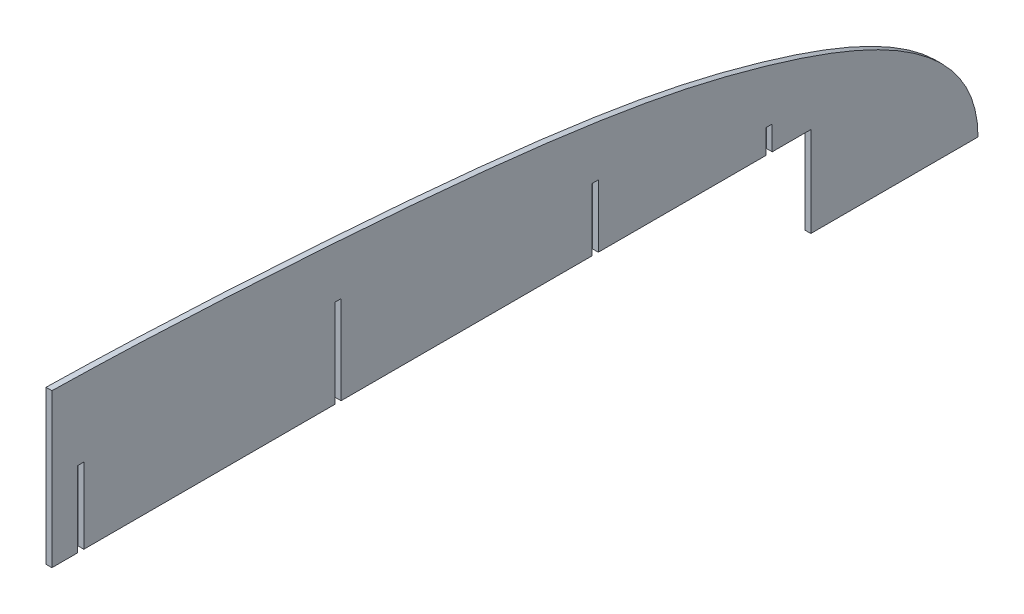
ISO-10303-21;
HEADER;
FILE_DESCRIPTION(('STEP AP214'),'2;1');
FILE_NAME('part.step','',(''),(''),'','','');
FILE_SCHEMA(('AUTOMOTIVE_DESIGN { 1 0 10303 214 1 1 1 1 }'));
ENDSEC;
DATA;
#1=APPLICATION_CONTEXT('core data for automotive mechanical design processes');
#2=APPLICATION_PROTOCOL_DEFINITION('international standard','automotive_design',2000,#1);
#3=PRODUCT_CONTEXT('',#1,'mechanical');
#4=PRODUCT('Part','Part','',(#3));
#5=PRODUCT_RELATED_PRODUCT_CATEGORY('part','',(#4));
#6=PRODUCT_DEFINITION_FORMATION('','',#4);
#7=PRODUCT_DEFINITION_CONTEXT('part definition',#1,'design');
#8=PRODUCT_DEFINITION('design','',#6,#7);
#9=PRODUCT_DEFINITION_SHAPE('','',#8);
#10=(LENGTH_UNIT() NAMED_UNIT(*) SI_UNIT(.MILLI.,.METRE.));
#11=(NAMED_UNIT(*) PLANE_ANGLE_UNIT() SI_UNIT($,.RADIAN.));
#12=(NAMED_UNIT(*) SI_UNIT($,.STERADIAN.) SOLID_ANGLE_UNIT());
#13=UNCERTAINTY_MEASURE_WITH_UNIT(LENGTH_MEASURE(1.E-05),#10,'distance_accuracy_value','');
#14=(GEOMETRIC_REPRESENTATION_CONTEXT(3) GLOBAL_UNCERTAINTY_ASSIGNED_CONTEXT((#13)) GLOBAL_UNIT_ASSIGNED_CONTEXT((#10,
#11,#12)) REPRESENTATION_CONTEXT('',''));
#15=CARTESIAN_POINT('',(0.,0.,0.));
#16=DIRECTION('',(0.,0.,1.));
#17=DIRECTION('',(1.,0.,0.));
#18=AXIS2_PLACEMENT_3D('',#15,#16,#17);
#19=CARTESIAN_POINT('',(2.921,39.6875,-381.));
#20=CARTESIAN_POINT('',(2.921,130.986638489082,-381.));
#21=CARTESIAN_POINT('',(2.921,207.087014824068,-192.838300002168));
#22=CARTESIAN_POINT('',(2.921,247.75344053516,19.653982034319));
#23=CARTESIAN_POINT('',(2.921,268.162472470018,254.872972462984));
#24=CARTESIAN_POINT('',(2.921,284.069445788471,549.517003243596));
#25=CARTESIAN_POINT('',(2.921,278.192638574035,889.863220578499));
#26=CARTESIAN_POINT('',(2.921,278.653196970913,1168.26453485061));
#27=CARTESIAN_POINT('',(2.921,238.643618873348,1400.44895878215));
#28=CARTESIAN_POINT('',(2.921,123.854582151285,1460.5));
#29=CARTESIAN_POINT('',(2.921,39.6875,1460.5));
#30=B_SPLINE_CURVE_WITH_KNOTS('',3,(#19,#20,#21,#22,#23,#24,#25,#26,#27,#28,#29),.UNSPECIFIED.,
.F.,.F.,(4,1,1,1,1,1,1,1,4),(0.,0.128798302419609,0.218593162728591,0.344649658829917,
0.470237251274815,0.658383603807385,0.846764992474732,0.885552356703056,1.),.UNSPECIFIED.);
#31=DIRECTION('',(-1.,0.,0.));
#32=VECTOR('',#31,1.);
#33=SURFACE_OF_LINEAR_EXTRUSION('',#30,#32);
#34=CARTESIAN_POINT('',(-2.921,39.6875,-381.));
#35=CARTESIAN_POINT('',(-2.921,130.986638489082,-381.));
#36=CARTESIAN_POINT('',(-2.921,207.087014824068,-192.838300002168));
#37=CARTESIAN_POINT('',(-2.921,247.75344053516,19.653982034319));
#38=CARTESIAN_POINT('',(-2.921,268.162472470018,254.872972462984));
#39=CARTESIAN_POINT('',(-2.921,284.069445788471,549.517003243596));
#40=CARTESIAN_POINT('',(-2.921,278.192638574035,889.863220578499));
#41=CARTESIAN_POINT('',(-2.921,278.653196970913,1168.26453485061));
#42=CARTESIAN_POINT('',(-2.921,238.643618873348,1400.44895878215));
#43=CARTESIAN_POINT('',(-2.921,123.854582151285,1460.5));
#44=CARTESIAN_POINT('',(-2.921,39.6875,1460.5));
#45=B_SPLINE_CURVE_WITH_KNOTS('',3,(#34,#35,#36,#37,#38,#39,#40,#41,#42,#43,#44),.UNSPECIFIED.,
.F.,.F.,(4,1,1,1,1,1,1,1,4),(0.,0.128798302419609,0.218593162728591,0.344649658829917,
0.470237251274815,0.658383603807385,0.846764992474732,0.885552356703056,1.),.UNSPECIFIED.);
#46=CARTESIAN_POINT('',(-2.921,39.6875,-381.));
#47=VERTEX_POINT('',#46);
#48=CARTESIAN_POINT('',(-2.921,279.971033323289,533.4));
#49=VERTEX_POINT('',#48);
#50=EDGE_CURVE('E196',#47,#49,#45,.T.);
#51=ORIENTED_EDGE('',*,*,#50,.T.);
#52=DIRECTION('',(-1.,0.,0.));
#53=VECTOR('',#52,1.);
#54=CARTESIAN_POINT('',(2.921,279.971033323289,533.4));
#55=LINE('',#54,#53);
#56=CARTESIAN_POINT('',(2.921,279.971033323289,533.4));
#57=VERTEX_POINT('',#56);
#58=EDGE_CURVE('E198',#49,#57,#55,.F.);
#59=ORIENTED_EDGE('',*,*,#58,.T.);
#60=CARTESIAN_POINT('',(2.921,39.6875,-381.));
#61=VERTEX_POINT('',#60);
#62=EDGE_CURVE('E197',#61,#57,#30,.T.);
#63=ORIENTED_EDGE('',*,*,#62,.F.);
#64=DIRECTION('',(-1.,0.,0.));
#65=VECTOR('',#64,1.);
#66=CARTESIAN_POINT('',(2.921,39.6875,-381.));
#67=LINE('',#66,#65);
#68=EDGE_CURVE('E11',#61,#47,#67,.T.);
#69=ORIENTED_EDGE('',*,*,#68,.T.);
#70=EDGE_LOOP('',(#51,#59,#63,#69));
#71=FACE_BOUND('',#70,.T.);
#72=ADVANCED_FACE('F33',(#71),#33,.F.);
#73=CARTESIAN_POINT('',(2.921,39.6875,1460.5));
#74=DIRECTION('',(0.,1.,0.));
#75=DIRECTION('',(0.,0.,1.));
#76=AXIS2_PLACEMENT_3D('',#73,#74,#75);
#77=PLANE('',#76);
#78=DIRECTION('',(0.,0.,-1.));
#79=VECTOR('',#78,1.);
#80=CARTESIAN_POINT('',(2.921,39.6875,1460.5));
#81=LINE('',#80,#79);
#82=CARTESIAN_POINT('',(2.921,39.6875,-215.9));
#83=VERTEX_POINT('',#82);
#84=EDGE_CURVE('E41',#83,#61,#81,.T.);
#85=ORIENTED_EDGE('',*,*,#84,.F.);
#86=DIRECTION('',(1.,0.,0.));
#87=VECTOR('',#86,1.);
#88=CARTESIAN_POINT('',(-2.921,39.6875,-215.9));
#89=LINE('',#88,#87);
#90=CARTESIAN_POINT('',(-2.921,39.6875,-215.9));
#91=VERTEX_POINT('',#90);
#92=EDGE_CURVE('E180',#91,#83,#89,.T.);
#93=ORIENTED_EDGE('',*,*,#92,.F.);
#94=DIRECTION('',(0.,0.,-1.));
#95=VECTOR('',#94,1.);
#96=CARTESIAN_POINT('',(-2.921,39.6875,1460.5));
#97=LINE('',#96,#95);
#98=EDGE_CURVE('E188',#91,#47,#97,.T.);
#99=ORIENTED_EDGE('',*,*,#98,.T.);
#100=ORIENTED_EDGE('',*,*,#68,.F.);
#101=EDGE_LOOP('',(#85,#93,#99,#100));
#102=FACE_BOUND('',#101,.T.);
#103=ADVANCED_FACE('F187',(#102),#77,.F.);
#104=CARTESIAN_POINT('',(2.921,280.539048276461,568.161185702042));
#105=DIRECTION('',(1.,0.,0.));
#106=DIRECTION('',(0.,0.,-1.));
#107=AXIS2_PLACEMENT_3D('',#104,#105,#106);
#108=PLANE('',#107);
#109=DIRECTION('',(0.,1.,0.));
#110=VECTOR('',#109,1.);
#111=CARTESIAN_POINT('',(2.921,394.349763681545,533.4));
#112=LINE('',#111,#110);
#113=CARTESIAN_POINT('',(2.921,128.5875,533.4));
#114=VERTEX_POINT('',#113);
#115=EDGE_CURVE('E184',#114,#57,#112,.T.);
#116=ORIENTED_EDGE('',*,*,#115,.F.);
#117=DIRECTION('',(0.,0.,1.));
#118=VECTOR('',#117,1.);
#119=CARTESIAN_POINT('',(2.921,128.5875,533.4));
#120=LINE('',#119,#118);
#121=CARTESIAN_POINT('',(2.921,128.5875,508.));
#122=VERTEX_POINT('',#121);
#123=EDGE_CURVE('E251',#122,#114,#120,.T.);
#124=ORIENTED_EDGE('',*,*,#123,.F.);
#125=DIRECTION('',(0.,-1.,0.));
#126=VECTOR('',#125,1.);
#127=CARTESIAN_POINT('',(2.921,128.5875,508.));
#128=LINE('',#127,#126);
#129=CARTESIAN_POINT('',(2.921,203.2,508.));
#130=VERTEX_POINT('',#129);
#131=EDGE_CURVE('E254',#130,#122,#128,.T.);
#132=ORIENTED_EDGE('',*,*,#131,.F.);
#133=DIRECTION('',(0.,0.,1.));
#134=VECTOR('',#133,1.);
#135=CARTESIAN_POINT('',(2.921,203.2,508.));
#136=LINE('',#135,#134);
#137=CARTESIAN_POINT('',(2.921,203.2,501.904));
#138=VERTEX_POINT('',#137);
#139=EDGE_CURVE('E257',#138,#130,#136,.T.);
#140=ORIENTED_EDGE('',*,*,#139,.F.);
#141=DIRECTION('',(0.,1.,0.));
#142=VECTOR('',#141,1.);
#143=CARTESIAN_POINT('',(2.921,203.2,501.904));
#144=LINE('',#143,#142);
#145=CARTESIAN_POINT('',(2.921,128.5875,501.904));
#146=VERTEX_POINT('',#145);
#147=EDGE_CURVE('E260',#146,#138,#144,.T.);
#148=ORIENTED_EDGE('',*,*,#147,.F.);
#149=DIRECTION('',(0.,0.,1.));
#150=VECTOR('',#149,1.);
#151=CARTESIAN_POINT('',(2.921,128.5875,501.904));
#152=LINE('',#151,#150);
#153=CARTESIAN_POINT('',(2.921,128.5875,254.));
#154=VERTEX_POINT('',#153);
#155=EDGE_CURVE('E263',#154,#146,#152,.T.);
#156=ORIENTED_EDGE('',*,*,#155,.F.);
#157=DIRECTION('',(0.,-1.,0.));
#158=VECTOR('',#157,1.);
#159=CARTESIAN_POINT('',(2.921,128.5875,254.));
#160=LINE('',#159,#158);
#161=CARTESIAN_POINT('',(2.921,215.9,254.));
#162=VERTEX_POINT('',#161);
#163=EDGE_CURVE('E266',#162,#154,#160,.T.);
#164=ORIENTED_EDGE('',*,*,#163,.F.);
#165=DIRECTION('',(0.,0.,1.));
#166=VECTOR('',#165,1.);
#167=CARTESIAN_POINT('',(2.921,215.9,254.));
#168=LINE('',#167,#166);
#169=CARTESIAN_POINT('',(2.921,215.9,247.904));
#170=VERTEX_POINT('',#169);
#171=EDGE_CURVE('E269',#170,#162,#168,.T.);
#172=ORIENTED_EDGE('',*,*,#171,.F.);
#173=DIRECTION('',(0.,1.,0.));
#174=VECTOR('',#173,1.);
#175=CARTESIAN_POINT('',(2.921,215.9,247.904));
#176=LINE('',#175,#174);
#177=CARTESIAN_POINT('',(2.921,128.5875,247.904));
#178=VERTEX_POINT('',#177);
#179=EDGE_CURVE('E272',#178,#170,#176,.T.);
#180=ORIENTED_EDGE('',*,*,#179,.F.);
#181=DIRECTION('',(0.,0.,1.));
#182=VECTOR('',#181,1.);
#183=CARTESIAN_POINT('',(2.921,128.5875,0.));
#184=LINE('',#183,#182);
#185=CARTESIAN_POINT('',(2.921,128.5875,0.));
#186=VERTEX_POINT('',#185);
#187=EDGE_CURVE('E275',#186,#178,#184,.T.);
#188=ORIENTED_EDGE('',*,*,#187,.F.);
#189=DIRECTION('',(0.,-1.,0.));
#190=VECTOR('',#189,1.);
#191=CARTESIAN_POINT('',(2.921,190.5,0.));
#192=LINE('',#191,#190);
#193=CARTESIAN_POINT('',(2.921,190.5,0.));
#194=VERTEX_POINT('',#193);
#195=EDGE_CURVE('E278',#194,#186,#192,.T.);
#196=ORIENTED_EDGE('',*,*,#195,.F.);
#197=DIRECTION('',(0.,0.,1.));
#198=VECTOR('',#197,1.);
#199=CARTESIAN_POINT('',(2.921,190.5,-6.09600000000001));
#200=LINE('',#199,#198);
#201=CARTESIAN_POINT('',(2.921,190.5,-6.09600000000001));
#202=VERTEX_POINT('',#201);
#203=EDGE_CURVE('E281',#202,#194,#200,.T.);
#204=ORIENTED_EDGE('',*,*,#203,.F.);
#205=DIRECTION('',(0.,1.,0.));
#206=VECTOR('',#205,1.);
#207=CARTESIAN_POINT('',(2.921,128.5875,-6.09600000000001));
#208=LINE('',#207,#206);
#209=CARTESIAN_POINT('',(2.921,128.5875,-6.09600000000001));
#210=VERTEX_POINT('',#209);
#211=EDGE_CURVE('E284',#210,#202,#208,.T.);
#212=ORIENTED_EDGE('',*,*,#211,.F.);
#213=DIRECTION('',(0.,0.,1.));
#214=VECTOR('',#213,1.);
#215=CARTESIAN_POINT('',(2.921,128.5875,-171.704));
#216=LINE('',#215,#214);
#217=CARTESIAN_POINT('',(2.921,128.5875,-171.704));
#218=VERTEX_POINT('',#217);
#219=EDGE_CURVE('E287',#218,#210,#216,.T.);
#220=ORIENTED_EDGE('',*,*,#219,.F.);
#221=DIRECTION('',(0.,-1.,0.));
#222=VECTOR('',#221,1.);
#223=CARTESIAN_POINT('',(2.921,152.4,-171.704));
#224=LINE('',#223,#222);
#225=CARTESIAN_POINT('',(2.921,152.4,-171.704));
#226=VERTEX_POINT('',#225);
#227=EDGE_CURVE('E290',#226,#218,#224,.T.);
#228=ORIENTED_EDGE('',*,*,#227,.F.);
#229=DIRECTION('',(0.,0.,1.));
#230=VECTOR('',#229,1.);
#231=CARTESIAN_POINT('',(2.921,152.4,-177.8));
#232=LINE('',#231,#230);
#233=CARTESIAN_POINT('',(2.921,152.4,-177.8));
#234=VERTEX_POINT('',#233);
#235=EDGE_CURVE('E293',#234,#226,#232,.T.);
#236=ORIENTED_EDGE('',*,*,#235,.F.);
#237=DIRECTION('',(0.,1.,0.));
#238=VECTOR('',#237,1.);
#239=CARTESIAN_POINT('',(2.921,128.5875,-177.8));
#240=LINE('',#239,#238);
#241=CARTESIAN_POINT('',(2.921,128.5875,-177.8));
#242=VERTEX_POINT('',#241);
#243=EDGE_CURVE('E296',#242,#234,#240,.T.);
#244=ORIENTED_EDGE('',*,*,#243,.F.);
#245=DIRECTION('',(0.,0.,1.));
#246=VECTOR('',#245,1.);
#247=CARTESIAN_POINT('',(2.921,128.5875,-215.9));
#248=LINE('',#247,#246);
#249=CARTESIAN_POINT('',(2.921,128.5875,-215.9));
#250=VERTEX_POINT('',#249);
#251=EDGE_CURVE('E299',#250,#242,#248,.T.);
#252=ORIENTED_EDGE('',*,*,#251,.F.);
#253=DIRECTION('',(0.,1.,0.));
#254=VECTOR('',#253,1.);
#255=CARTESIAN_POINT('',(2.921,39.6875,-215.9));
#256=LINE('',#255,#254);
#257=EDGE_CURVE('E302',#83,#250,#256,.T.);
#258=ORIENTED_EDGE('',*,*,#257,.F.);
#259=ORIENTED_EDGE('',*,*,#84,.T.);
#260=ORIENTED_EDGE('',*,*,#62,.T.);
#261=EDGE_LOOP('',(#116,#124,#132,#140,#148,#156,#164,#172,#180,#188,#196,#204,#212,#220,#228,
#236,#244,#252,#258,#259,#260));
#262=FACE_BOUND('',#261,.T.);
#263=ADVANCED_FACE('F422',(#262),#108,.T.);
#264=CARTESIAN_POINT('',(-2.921,280.539048276461,568.161185702042));
#265=DIRECTION('',(1.,0.,0.));
#266=DIRECTION('',(0.,0.,-1.));
#267=AXIS2_PLACEMENT_3D('',#264,#265,#266);
#268=PLANE('',#267);
#269=DIRECTION('',(0.,0.,1.));
#270=VECTOR('',#269,1.);
#271=CARTESIAN_POINT('',(-2.921,128.5875,533.4));
#272=LINE('',#271,#270);
#273=CARTESIAN_POINT('',(-2.921,128.5875,508.));
#274=VERTEX_POINT('',#273);
#275=CARTESIAN_POINT('',(-2.921,128.5875,533.4));
#276=VERTEX_POINT('',#275);
#277=EDGE_CURVE('E305',#274,#276,#272,.T.);
#278=ORIENTED_EDGE('',*,*,#277,.T.);
#279=DIRECTION('',(0.,1.,0.));
#280=VECTOR('',#279,1.);
#281=CARTESIAN_POINT('',(-2.921,394.349763681545,533.4));
#282=LINE('',#281,#280);
#283=EDGE_CURVE('E189',#276,#49,#282,.T.);
#284=ORIENTED_EDGE('',*,*,#283,.T.);
#285=ORIENTED_EDGE('',*,*,#50,.F.);
#286=ORIENTED_EDGE('',*,*,#98,.F.);
#287=DIRECTION('',(0.,1.,0.));
#288=VECTOR('',#287,1.);
#289=CARTESIAN_POINT('',(-2.921,39.6875,-215.9));
#290=LINE('',#289,#288);
#291=CARTESIAN_POINT('',(-2.921,128.5875,-215.9));
#292=VERTEX_POINT('',#291);
#293=EDGE_CURVE('E176',#91,#292,#290,.T.);
#294=ORIENTED_EDGE('',*,*,#293,.T.);
#295=DIRECTION('',(0.,0.,1.));
#296=VECTOR('',#295,1.);
#297=CARTESIAN_POINT('',(-2.921,128.5875,-215.9));
#298=LINE('',#297,#296);
#299=CARTESIAN_POINT('',(-2.921,128.5875,-177.8));
#300=VERTEX_POINT('',#299);
#301=EDGE_CURVE('E48',#292,#300,#298,.T.);
#302=ORIENTED_EDGE('',*,*,#301,.T.);
#303=DIRECTION('',(0.,1.,0.));
#304=VECTOR('',#303,1.);
#305=CARTESIAN_POINT('',(-2.921,128.5875,-177.8));
#306=LINE('',#305,#304);
#307=CARTESIAN_POINT('',(-2.921,152.4,-177.8));
#308=VERTEX_POINT('',#307);
#309=EDGE_CURVE('E349',#300,#308,#306,.T.);
#310=ORIENTED_EDGE('',*,*,#309,.T.);
#311=DIRECTION('',(0.,0.,1.));
#312=VECTOR('',#311,1.);
#313=CARTESIAN_POINT('',(-2.921,152.4,-177.8));
#314=LINE('',#313,#312);
#315=CARTESIAN_POINT('',(-2.921,152.4,-171.704));
#316=VERTEX_POINT('',#315);
#317=EDGE_CURVE('E346',#308,#316,#314,.T.);
#318=ORIENTED_EDGE('',*,*,#317,.T.);
#319=DIRECTION('',(0.,-1.,0.));
#320=VECTOR('',#319,1.);
#321=CARTESIAN_POINT('',(-2.921,152.4,-171.704));
#322=LINE('',#321,#320);
#323=CARTESIAN_POINT('',(-2.921,128.5875,-171.704));
#324=VERTEX_POINT('',#323);
#325=EDGE_CURVE('E343',#316,#324,#322,.T.);
#326=ORIENTED_EDGE('',*,*,#325,.T.);
#327=DIRECTION('',(0.,0.,1.));
#328=VECTOR('',#327,1.);
#329=CARTESIAN_POINT('',(-2.921,128.5875,-171.704));
#330=LINE('',#329,#328);
#331=CARTESIAN_POINT('',(-2.921,128.5875,-6.09600000000001));
#332=VERTEX_POINT('',#331);
#333=EDGE_CURVE('E340',#324,#332,#330,.T.);
#334=ORIENTED_EDGE('',*,*,#333,.T.);
#335=DIRECTION('',(0.,1.,0.));
#336=VECTOR('',#335,1.);
#337=CARTESIAN_POINT('',(-2.921,128.5875,-6.09600000000001));
#338=LINE('',#337,#336);
#339=CARTESIAN_POINT('',(-2.921,190.5,-6.09600000000001));
#340=VERTEX_POINT('',#339);
#341=EDGE_CURVE('E337',#332,#340,#338,.T.);
#342=ORIENTED_EDGE('',*,*,#341,.T.);
#343=DIRECTION('',(0.,0.,1.));
#344=VECTOR('',#343,1.);
#345=CARTESIAN_POINT('',(-2.921,190.5,-6.09600000000001));
#346=LINE('',#345,#344);
#347=CARTESIAN_POINT('',(-2.921,190.5,0.));
#348=VERTEX_POINT('',#347);
#349=EDGE_CURVE('E334',#340,#348,#346,.T.);
#350=ORIENTED_EDGE('',*,*,#349,.T.);
#351=DIRECTION('',(0.,-1.,0.));
#352=VECTOR('',#351,1.);
#353=CARTESIAN_POINT('',(-2.921,190.5,0.));
#354=LINE('',#353,#352);
#355=CARTESIAN_POINT('',(-2.921,128.5875,0.));
#356=VERTEX_POINT('',#355);
#357=EDGE_CURVE('E331',#348,#356,#354,.T.);
#358=ORIENTED_EDGE('',*,*,#357,.T.);
#359=DIRECTION('',(0.,0.,1.));
#360=VECTOR('',#359,1.);
#361=CARTESIAN_POINT('',(-2.921,128.5875,0.));
#362=LINE('',#361,#360);
#363=CARTESIAN_POINT('',(-2.921,128.5875,247.904));
#364=VERTEX_POINT('',#363);
#365=EDGE_CURVE('E328',#356,#364,#362,.T.);
#366=ORIENTED_EDGE('',*,*,#365,.T.);
#367=DIRECTION('',(0.,1.,0.));
#368=VECTOR('',#367,1.);
#369=CARTESIAN_POINT('',(-2.921,215.9,247.904));
#370=LINE('',#369,#368);
#371=CARTESIAN_POINT('',(-2.921,215.9,247.904));
#372=VERTEX_POINT('',#371);
#373=EDGE_CURVE('E325',#364,#372,#370,.T.);
#374=ORIENTED_EDGE('',*,*,#373,.T.);
#375=DIRECTION('',(0.,0.,1.));
#376=VECTOR('',#375,1.);
#377=CARTESIAN_POINT('',(-2.921,215.9,254.));
#378=LINE('',#377,#376);
#379=CARTESIAN_POINT('',(-2.921,215.9,254.));
#380=VERTEX_POINT('',#379);
#381=EDGE_CURVE('E322',#372,#380,#378,.T.);
#382=ORIENTED_EDGE('',*,*,#381,.T.);
#383=DIRECTION('',(0.,-1.,0.));
#384=VECTOR('',#383,1.);
#385=CARTESIAN_POINT('',(-2.921,128.5875,254.));
#386=LINE('',#385,#384);
#387=CARTESIAN_POINT('',(-2.921,128.5875,254.));
#388=VERTEX_POINT('',#387);
#389=EDGE_CURVE('E319',#380,#388,#386,.T.);
#390=ORIENTED_EDGE('',*,*,#389,.T.);
#391=DIRECTION('',(0.,0.,1.));
#392=VECTOR('',#391,1.);
#393=CARTESIAN_POINT('',(-2.921,128.5875,501.904));
#394=LINE('',#393,#392);
#395=CARTESIAN_POINT('',(-2.921,128.5875,501.904));
#396=VERTEX_POINT('',#395);
#397=EDGE_CURVE('E316',#388,#396,#394,.T.);
#398=ORIENTED_EDGE('',*,*,#397,.T.);
#399=DIRECTION('',(0.,1.,0.));
#400=VECTOR('',#399,1.);
#401=CARTESIAN_POINT('',(-2.921,203.2,501.904));
#402=LINE('',#401,#400);
#403=CARTESIAN_POINT('',(-2.921,203.2,501.904));
#404=VERTEX_POINT('',#403);
#405=EDGE_CURVE('E313',#396,#404,#402,.T.);
#406=ORIENTED_EDGE('',*,*,#405,.T.);
#407=DIRECTION('',(0.,0.,1.));
#408=VECTOR('',#407,1.);
#409=CARTESIAN_POINT('',(-2.921,203.2,508.));
#410=LINE('',#409,#408);
#411=CARTESIAN_POINT('',(-2.921,203.2,508.));
#412=VERTEX_POINT('',#411);
#413=EDGE_CURVE('E310',#404,#412,#410,.T.);
#414=ORIENTED_EDGE('',*,*,#413,.T.);
#415=DIRECTION('',(0.,-1.,0.));
#416=VECTOR('',#415,1.);
#417=CARTESIAN_POINT('',(-2.921,128.5875,508.));
#418=LINE('',#417,#416);
#419=EDGE_CURVE('E307',#412,#274,#418,.T.);
#420=ORIENTED_EDGE('',*,*,#419,.T.);
#421=EDGE_LOOP('',(#278,#284,#285,#286,#294,#302,#310,#318,#326,#334,#342,#350,#358,#366,#374,
#382,#390,#398,#406,#414,#420));
#422=FACE_BOUND('',#421,.T.);
#423=ADVANCED_FACE('F193',(#422),#268,.F.);
#424=CARTESIAN_POINT('',(-2.921,394.349763681545,533.4));
#425=DIRECTION('',(0.,0.,-1.));
#426=DIRECTION('',(0.,1.,0.));
#427=AXIS2_PLACEMENT_3D('',#424,#425,#426);
#428=PLANE('',#427);
#429=ORIENTED_EDGE('',*,*,#283,.F.);
#430=DIRECTION('',(1.,0.,0.));
#431=VECTOR('',#430,1.);
#432=CARTESIAN_POINT('',(-2.921,128.5875,533.4));
#433=LINE('',#432,#431);
#434=EDGE_CURVE('E214',#276,#114,#433,.T.);
#435=ORIENTED_EDGE('',*,*,#434,.T.);
#436=ORIENTED_EDGE('',*,*,#115,.T.);
#437=ORIENTED_EDGE('',*,*,#58,.F.);
#438=EDGE_LOOP('',(#429,#435,#436,#437));
#439=FACE_BOUND('',#438,.T.);
#440=ADVANCED_FACE('F419',(#439),#428,.F.);
#441=CARTESIAN_POINT('',(-2.921,128.5875,533.4));
#442=DIRECTION('',(0.,1.,0.));
#443=DIRECTION('',(0.,0.,1.));
#444=AXIS2_PLACEMENT_3D('',#441,#442,#443);
#445=PLANE('',#444);
#446=ORIENTED_EDGE('',*,*,#123,.T.);
#447=ORIENTED_EDGE('',*,*,#434,.F.);
#448=ORIENTED_EDGE('',*,*,#277,.F.);
#449=DIRECTION('',(1.,0.,0.));
#450=VECTOR('',#449,1.);
#451=CARTESIAN_POINT('',(-2.921,128.5875,508.));
#452=LINE('',#451,#450);
#453=EDGE_CURVE('E247',#274,#122,#452,.T.);
#454=ORIENTED_EDGE('',*,*,#453,.T.);
#455=EDGE_LOOP('',(#446,#447,#448,#454));
#456=FACE_BOUND('',#455,.T.);
#457=ADVANCED_FACE('F415',(#456),#445,.F.);
#458=CARTESIAN_POINT('',(-2.921,128.5875,508.));
#459=DIRECTION('',(0.,0.,1.));
#460=DIRECTION('',(1.,0.,0.));
#461=AXIS2_PLACEMENT_3D('',#458,#459,#460);
#462=PLANE('',#461);
#463=ORIENTED_EDGE('',*,*,#131,.T.);
#464=ORIENTED_EDGE('',*,*,#453,.F.);
#465=ORIENTED_EDGE('',*,*,#419,.F.);
#466=DIRECTION('',(1.,0.,0.));
#467=VECTOR('',#466,1.);
#468=CARTESIAN_POINT('',(-2.921,203.2,508.));
#469=LINE('',#468,#467);
#470=EDGE_CURVE('E245',#412,#130,#469,.T.);
#471=ORIENTED_EDGE('',*,*,#470,.T.);
#472=EDGE_LOOP('',(#463,#464,#465,#471));
#473=FACE_BOUND('',#472,.T.);
#474=ADVANCED_FACE('F411',(#473),#462,.F.);
#475=CARTESIAN_POINT('',(-2.921,203.2,508.));
#476=DIRECTION('',(0.,1.,0.));
#477=DIRECTION('',(0.,0.,1.));
#478=AXIS2_PLACEMENT_3D('',#475,#476,#477);
#479=PLANE('',#478);
#480=ORIENTED_EDGE('',*,*,#139,.T.);
#481=ORIENTED_EDGE('',*,*,#470,.F.);
#482=ORIENTED_EDGE('',*,*,#413,.F.);
#483=DIRECTION('',(1.,0.,0.));
#484=VECTOR('',#483,1.);
#485=CARTESIAN_POINT('',(-2.921,203.2,501.904));
#486=LINE('',#485,#484);
#487=EDGE_CURVE('E243',#404,#138,#486,.T.);
#488=ORIENTED_EDGE('',*,*,#487,.T.);
#489=EDGE_LOOP('',(#480,#481,#482,#488));
#490=FACE_BOUND('',#489,.T.);
#491=ADVANCED_FACE('F407',(#490),#479,.F.);
#492=CARTESIAN_POINT('',(-2.921,203.2,501.904));
#493=DIRECTION('',(0.,0.,-1.));
#494=DIRECTION('',(-1.,0.,0.));
#495=AXIS2_PLACEMENT_3D('',#492,#493,#494);
#496=PLANE('',#495);
#497=ORIENTED_EDGE('',*,*,#147,.T.);
#498=ORIENTED_EDGE('',*,*,#487,.F.);
#499=ORIENTED_EDGE('',*,*,#405,.F.);
#500=DIRECTION('',(1.,0.,0.));
#501=VECTOR('',#500,1.);
#502=CARTESIAN_POINT('',(-2.921,128.5875,501.904));
#503=LINE('',#502,#501);
#504=EDGE_CURVE('E241',#396,#146,#503,.T.);
#505=ORIENTED_EDGE('',*,*,#504,.T.);
#506=EDGE_LOOP('',(#497,#498,#499,#505));
#507=FACE_BOUND('',#506,.T.);
#508=ADVANCED_FACE('F403',(#507),#496,.F.);
#509=CARTESIAN_POINT('',(-2.921,128.5875,501.904));
#510=DIRECTION('',(0.,1.,0.));
#511=DIRECTION('',(0.,0.,1.));
#512=AXIS2_PLACEMENT_3D('',#509,#510,#511);
#513=PLANE('',#512);
#514=ORIENTED_EDGE('',*,*,#155,.T.);
#515=ORIENTED_EDGE('',*,*,#504,.F.);
#516=ORIENTED_EDGE('',*,*,#397,.F.);
#517=DIRECTION('',(1.,0.,0.));
#518=VECTOR('',#517,1.);
#519=CARTESIAN_POINT('',(-2.921,128.5875,254.));
#520=LINE('',#519,#518);
#521=EDGE_CURVE('E239',#388,#154,#520,.T.);
#522=ORIENTED_EDGE('',*,*,#521,.T.);
#523=EDGE_LOOP('',(#514,#515,#516,#522));
#524=FACE_BOUND('',#523,.T.);
#525=ADVANCED_FACE('F399',(#524),#513,.F.);
#526=CARTESIAN_POINT('',(-2.921,128.5875,254.));
#527=DIRECTION('',(0.,0.,1.));
#528=DIRECTION('',(0.,-1.,0.));
#529=AXIS2_PLACEMENT_3D('',#526,#527,#528);
#530=PLANE('',#529);
#531=ORIENTED_EDGE('',*,*,#163,.T.);
#532=ORIENTED_EDGE('',*,*,#521,.F.);
#533=ORIENTED_EDGE('',*,*,#389,.F.);
#534=DIRECTION('',(1.,0.,0.));
#535=VECTOR('',#534,1.);
#536=CARTESIAN_POINT('',(-2.921,215.9,254.));
#537=LINE('',#536,#535);
#538=EDGE_CURVE('E237',#380,#162,#537,.T.);
#539=ORIENTED_EDGE('',*,*,#538,.T.);
#540=EDGE_LOOP('',(#531,#532,#533,#539));
#541=FACE_BOUND('',#540,.T.);
#542=ADVANCED_FACE('F395',(#541),#530,.F.);
#543=CARTESIAN_POINT('',(-2.921,215.9,254.));
#544=DIRECTION('',(0.,1.,0.));
#545=DIRECTION('',(0.,0.,1.));
#546=AXIS2_PLACEMENT_3D('',#543,#544,#545);
#547=PLANE('',#546);
#548=ORIENTED_EDGE('',*,*,#171,.T.);
#549=ORIENTED_EDGE('',*,*,#538,.F.);
#550=ORIENTED_EDGE('',*,*,#381,.F.);
#551=DIRECTION('',(1.,0.,0.));
#552=VECTOR('',#551,1.);
#553=CARTESIAN_POINT('',(-2.921,215.9,247.904));
#554=LINE('',#553,#552);
#555=EDGE_CURVE('E235',#372,#170,#554,.T.);
#556=ORIENTED_EDGE('',*,*,#555,.T.);
#557=EDGE_LOOP('',(#548,#549,#550,#556));
#558=FACE_BOUND('',#557,.T.);
#559=ADVANCED_FACE('F391',(#558),#547,.F.);
#560=CARTESIAN_POINT('',(-2.921,215.9,247.904));
#561=DIRECTION('',(0.,0.,-1.));
#562=DIRECTION('',(-1.,0.,0.));
#563=AXIS2_PLACEMENT_3D('',#560,#561,#562);
#564=PLANE('',#563);
#565=ORIENTED_EDGE('',*,*,#179,.T.);
#566=ORIENTED_EDGE('',*,*,#555,.F.);
#567=ORIENTED_EDGE('',*,*,#373,.F.);
#568=DIRECTION('',(1.,0.,0.));
#569=VECTOR('',#568,1.);
#570=CARTESIAN_POINT('',(-2.921,128.5875,247.904));
#571=LINE('',#570,#569);
#572=EDGE_CURVE('E233',#364,#178,#571,.T.);
#573=ORIENTED_EDGE('',*,*,#572,.T.);
#574=EDGE_LOOP('',(#565,#566,#567,#573));
#575=FACE_BOUND('',#574,.T.);
#576=ADVANCED_FACE('F387',(#575),#564,.F.);
#577=CARTESIAN_POINT('',(-2.921,128.5875,0.));
#578=DIRECTION('',(0.,1.,0.));
#579=DIRECTION('',(0.,0.,1.));
#580=AXIS2_PLACEMENT_3D('',#577,#578,#579);
#581=PLANE('',#580);
#582=ORIENTED_EDGE('',*,*,#187,.T.);
#583=ORIENTED_EDGE('',*,*,#572,.F.);
#584=ORIENTED_EDGE('',*,*,#365,.F.);
#585=DIRECTION('',(1.,0.,0.));
#586=VECTOR('',#585,1.);
#587=CARTESIAN_POINT('',(-2.921,128.5875,0.));
#588=LINE('',#587,#586);
#589=EDGE_CURVE('E231',#356,#186,#588,.T.);
#590=ORIENTED_EDGE('',*,*,#589,.T.);
#591=EDGE_LOOP('',(#582,#583,#584,#590));
#592=FACE_BOUND('',#591,.T.);
#593=ADVANCED_FACE('F383',(#592),#581,.F.);
#594=CARTESIAN_POINT('',(-2.921,190.5,0.));
#595=DIRECTION('',(0.,0.,1.));
#596=DIRECTION('',(0.,-1.,0.));
#597=AXIS2_PLACEMENT_3D('',#594,#595,#596);
#598=PLANE('',#597);
#599=ORIENTED_EDGE('',*,*,#195,.T.);
#600=ORIENTED_EDGE('',*,*,#589,.F.);
#601=ORIENTED_EDGE('',*,*,#357,.F.);
#602=DIRECTION('',(1.,0.,0.));
#603=VECTOR('',#602,1.);
#604=CARTESIAN_POINT('',(-2.921,190.5,0.));
#605=LINE('',#604,#603);
#606=EDGE_CURVE('E229',#348,#194,#605,.T.);
#607=ORIENTED_EDGE('',*,*,#606,.T.);
#608=EDGE_LOOP('',(#599,#600,#601,#607));
#609=FACE_BOUND('',#608,.T.);
#610=ADVANCED_FACE('F379',(#609),#598,.F.);
#611=CARTESIAN_POINT('',(-2.921,190.5,-6.09600000000001));
#612=DIRECTION('',(0.,1.,0.));
#613=DIRECTION('',(0.,0.,1.));
#614=AXIS2_PLACEMENT_3D('',#611,#612,#613);
#615=PLANE('',#614);
#616=ORIENTED_EDGE('',*,*,#203,.T.);
#617=ORIENTED_EDGE('',*,*,#606,.F.);
#618=ORIENTED_EDGE('',*,*,#349,.F.);
#619=DIRECTION('',(1.,0.,0.));
#620=VECTOR('',#619,1.);
#621=CARTESIAN_POINT('',(-2.921,190.5,-6.09600000000001));
#622=LINE('',#621,#620);
#623=EDGE_CURVE('E227',#340,#202,#622,.T.);
#624=ORIENTED_EDGE('',*,*,#623,.T.);
#625=EDGE_LOOP('',(#616,#617,#618,#624));
#626=FACE_BOUND('',#625,.T.);
#627=ADVANCED_FACE('F375',(#626),#615,.F.);
#628=CARTESIAN_POINT('',(-2.921,128.5875,-6.09600000000001));
#629=DIRECTION('',(0.,0.,-1.));
#630=DIRECTION('',(-1.,0.,0.));
#631=AXIS2_PLACEMENT_3D('',#628,#629,#630);
#632=PLANE('',#631);
#633=ORIENTED_EDGE('',*,*,#211,.T.);
#634=ORIENTED_EDGE('',*,*,#623,.F.);
#635=ORIENTED_EDGE('',*,*,#341,.F.);
#636=DIRECTION('',(1.,0.,0.));
#637=VECTOR('',#636,1.);
#638=CARTESIAN_POINT('',(-2.921,128.5875,-6.09600000000001));
#639=LINE('',#638,#637);
#640=EDGE_CURVE('E225',#332,#210,#639,.T.);
#641=ORIENTED_EDGE('',*,*,#640,.T.);
#642=EDGE_LOOP('',(#633,#634,#635,#641));
#643=FACE_BOUND('',#642,.T.);
#644=ADVANCED_FACE('F371',(#643),#632,.F.);
#645=CARTESIAN_POINT('',(-2.921,128.5875,-171.704));
#646=DIRECTION('',(0.,1.,0.));
#647=DIRECTION('',(0.,0.,1.));
#648=AXIS2_PLACEMENT_3D('',#645,#646,#647);
#649=PLANE('',#648);
#650=ORIENTED_EDGE('',*,*,#219,.T.);
#651=ORIENTED_EDGE('',*,*,#640,.F.);
#652=ORIENTED_EDGE('',*,*,#333,.F.);
#653=DIRECTION('',(1.,0.,0.));
#654=VECTOR('',#653,1.);
#655=CARTESIAN_POINT('',(-2.921,128.5875,-171.704));
#656=LINE('',#655,#654);
#657=EDGE_CURVE('E223',#324,#218,#656,.T.);
#658=ORIENTED_EDGE('',*,*,#657,.T.);
#659=EDGE_LOOP('',(#650,#651,#652,#658));
#660=FACE_BOUND('',#659,.T.);
#661=ADVANCED_FACE('F367',(#660),#649,.F.);
#662=CARTESIAN_POINT('',(-2.921,152.4,-171.704));
#663=DIRECTION('',(0.,0.,1.));
#664=DIRECTION('',(1.,0.,0.));
#665=AXIS2_PLACEMENT_3D('',#662,#663,#664);
#666=PLANE('',#665);
#667=ORIENTED_EDGE('',*,*,#227,.T.);
#668=ORIENTED_EDGE('',*,*,#657,.F.);
#669=ORIENTED_EDGE('',*,*,#325,.F.);
#670=DIRECTION('',(1.,0.,0.));
#671=VECTOR('',#670,1.);
#672=CARTESIAN_POINT('',(-2.921,152.4,-171.704));
#673=LINE('',#672,#671);
#674=EDGE_CURVE('E221',#316,#226,#673,.T.);
#675=ORIENTED_EDGE('',*,*,#674,.T.);
#676=EDGE_LOOP('',(#667,#668,#669,#675));
#677=FACE_BOUND('',#676,.T.);
#678=ADVANCED_FACE('F363',(#677),#666,.F.);
#679=CARTESIAN_POINT('',(-2.921,152.4,-177.8));
#680=DIRECTION('',(0.,1.,0.));
#681=DIRECTION('',(0.,0.,1.));
#682=AXIS2_PLACEMENT_3D('',#679,#680,#681);
#683=PLANE('',#682);
#684=ORIENTED_EDGE('',*,*,#235,.T.);
#685=ORIENTED_EDGE('',*,*,#674,.F.);
#686=ORIENTED_EDGE('',*,*,#317,.F.);
#687=DIRECTION('',(1.,0.,0.));
#688=VECTOR('',#687,1.);
#689=CARTESIAN_POINT('',(-2.921,152.4,-177.8));
#690=LINE('',#689,#688);
#691=EDGE_CURVE('E219',#308,#234,#690,.T.);
#692=ORIENTED_EDGE('',*,*,#691,.T.);
#693=EDGE_LOOP('',(#684,#685,#686,#692));
#694=FACE_BOUND('',#693,.T.);
#695=ADVANCED_FACE('F359',(#694),#683,.F.);
#696=CARTESIAN_POINT('',(-2.921,128.5875,-177.8));
#697=DIRECTION('',(0.,0.,-1.));
#698=DIRECTION('',(-1.,0.,0.));
#699=AXIS2_PLACEMENT_3D('',#696,#697,#698);
#700=PLANE('',#699);
#701=ORIENTED_EDGE('',*,*,#243,.T.);
#702=ORIENTED_EDGE('',*,*,#691,.F.);
#703=ORIENTED_EDGE('',*,*,#309,.F.);
#704=DIRECTION('',(1.,0.,0.));
#705=VECTOR('',#704,1.);
#706=CARTESIAN_POINT('',(-2.921,128.5875,-177.8));
#707=LINE('',#706,#705);
#708=EDGE_CURVE('E217',#300,#242,#707,.T.);
#709=ORIENTED_EDGE('',*,*,#708,.T.);
#710=EDGE_LOOP('',(#701,#702,#703,#709));
#711=FACE_BOUND('',#710,.T.);
#712=ADVANCED_FACE('F355',(#711),#700,.F.);
#713=CARTESIAN_POINT('',(-2.921,128.5875,-215.9));
#714=DIRECTION('',(0.,1.,0.));
#715=DIRECTION('',(0.,0.,1.));
#716=AXIS2_PLACEMENT_3D('',#713,#714,#715);
#717=PLANE('',#716);
#718=ORIENTED_EDGE('',*,*,#251,.T.);
#719=ORIENTED_EDGE('',*,*,#708,.F.);
#720=ORIENTED_EDGE('',*,*,#301,.F.);
#721=DIRECTION('',(1.,0.,0.));
#722=VECTOR('',#721,1.);
#723=CARTESIAN_POINT('',(-2.921,128.5875,-215.9));
#724=LINE('',#723,#722);
#725=EDGE_CURVE('E181',#292,#250,#724,.T.);
#726=ORIENTED_EDGE('',*,*,#725,.T.);
#727=EDGE_LOOP('',(#718,#719,#720,#726));
#728=FACE_BOUND('',#727,.T.);
#729=ADVANCED_FACE('F424',(#728),#717,.F.);
#730=CARTESIAN_POINT('',(-2.921,39.6875,-215.9));
#731=DIRECTION('',(0.,0.,-1.));
#732=DIRECTION('',(-1.,0.,0.));
#733=AXIS2_PLACEMENT_3D('',#730,#731,#732);
#734=PLANE('',#733);
#735=ORIENTED_EDGE('',*,*,#257,.T.);
#736=ORIENTED_EDGE('',*,*,#725,.F.);
#737=ORIENTED_EDGE('',*,*,#293,.F.);
#738=ORIENTED_EDGE('',*,*,#92,.T.);
#739=EDGE_LOOP('',(#735,#736,#737,#738));
#740=FACE_BOUND('',#739,.T.);
#741=ADVANCED_FACE('F179',(#740),#734,.F.);
#742=CLOSED_SHELL('',(#72,#103,#263,#423,#440,#457,#474,#491,#508,#525,#542,#559,#576,#593,#610,
#627,#644,#661,#678,#695,#712,#729,#741));
#743=MANIFOLD_SOLID_BREP('B2',#742);
#744=ADVANCED_BREP_SHAPE_REPRESENTATION('',(#18,#743),#14);
#745=SHAPE_DEFINITION_REPRESENTATION(#9,#744);
ENDSEC;
END-ISO-10303-21;
